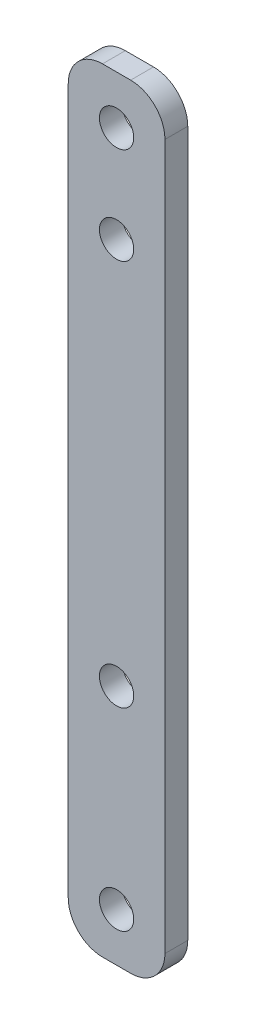
ISO-10303-21;
HEADER;
FILE_DESCRIPTION(('STEP AP214'),'2;1');
FILE_NAME('part.step','',(''),(''),'','','');
FILE_SCHEMA(('AUTOMOTIVE_DESIGN { 1 0 10303 214 1 1 1 1 }'));
ENDSEC;
DATA;
#1=APPLICATION_CONTEXT('core data for automotive mechanical design processes');
#2=APPLICATION_PROTOCOL_DEFINITION('international standard','automotive_design',2000,#1);
#3=PRODUCT_CONTEXT('',#1,'mechanical');
#4=PRODUCT('Part','Part','',(#3));
#5=PRODUCT_RELATED_PRODUCT_CATEGORY('part','',(#4));
#6=PRODUCT_DEFINITION_FORMATION('','',#4);
#7=PRODUCT_DEFINITION_CONTEXT('part definition',#1,'design');
#8=PRODUCT_DEFINITION('design','',#6,#7);
#9=PRODUCT_DEFINITION_SHAPE('','',#8);
#10=(LENGTH_UNIT() NAMED_UNIT(*) SI_UNIT(.MILLI.,.METRE.));
#11=(NAMED_UNIT(*) PLANE_ANGLE_UNIT() SI_UNIT($,.RADIAN.));
#12=(NAMED_UNIT(*) SI_UNIT($,.STERADIAN.) SOLID_ANGLE_UNIT());
#13=UNCERTAINTY_MEASURE_WITH_UNIT(LENGTH_MEASURE(1.E-05),#10,'distance_accuracy_value','');
#14=(GEOMETRIC_REPRESENTATION_CONTEXT(3) GLOBAL_UNCERTAINTY_ASSIGNED_CONTEXT((#13)) GLOBAL_UNIT_ASSIGNED_CONTEXT((#10,
#11,#12)) REPRESENTATION_CONTEXT('',''));
#15=CARTESIAN_POINT('',(0.,0.,0.));
#16=DIRECTION('',(0.,0.,1.));
#17=DIRECTION('',(1.,0.,0.));
#18=AXIS2_PLACEMENT_3D('',#15,#16,#17);
#19=CARTESIAN_POINT('',(0.,0.,3.));
#20=DIRECTION('',(0.,0.,-1.));
#21=DIRECTION('',(-1.,0.,0.));
#22=AXIS2_PLACEMENT_3D('',#19,#20,#21);
#23=PLANE('',#22);
#24=DIRECTION('',(1.,0.,0.));
#25=VECTOR('',#24,1.);
#26=CARTESIAN_POINT('',(0.,0.,3.));
#27=LINE('',#26,#25);
#28=CARTESIAN_POINT('',(4.5,0.,3.));
#29=VERTEX_POINT('',#28);
#30=CARTESIAN_POINT('',(8.2,0.,3.));
#31=VERTEX_POINT('',#30);
#32=EDGE_CURVE('E183',#29,#31,#27,.T.);
#33=ORIENTED_EDGE('',*,*,#32,.T.);
#34=CARTESIAN_POINT('',(8.2,4.5,3.));
#35=DIRECTION('',(0.,0.,-1.));
#36=DIRECTION('',(-1.,0.,0.));
#37=AXIS2_PLACEMENT_3D('',#34,#35,#36);
#38=CIRCLE('',#37,4.5);
#39=CARTESIAN_POINT('',(12.7,4.5,3.));
#40=VERTEX_POINT('',#39);
#41=EDGE_CURVE('E169',#31,#40,#38,.F.);
#42=ORIENTED_EDGE('',*,*,#41,.T.);
#43=DIRECTION('',(0.,1.,0.));
#44=VECTOR('',#43,1.);
#45=CARTESIAN_POINT('',(12.7,0.,3.));
#46=LINE('',#45,#44);
#47=CARTESIAN_POINT('',(12.7,97.1,3.));
#48=VERTEX_POINT('',#47);
#49=EDGE_CURVE('E126',#40,#48,#46,.T.);
#50=ORIENTED_EDGE('',*,*,#49,.T.);
#51=CARTESIAN_POINT('',(8.2,97.1,3.));
#52=DIRECTION('',(0.,0.,-1.));
#53=DIRECTION('',(-1.,0.,0.));
#54=AXIS2_PLACEMENT_3D('',#51,#52,#53);
#55=CIRCLE('',#54,4.5);
#56=CARTESIAN_POINT('',(8.2,101.6,3.));
#57=VERTEX_POINT('',#56);
#58=EDGE_CURVE('E61',#48,#57,#55,.F.);
#59=ORIENTED_EDGE('',*,*,#58,.T.);
#60=DIRECTION('',(-1.,0.,0.));
#61=VECTOR('',#60,1.);
#62=CARTESIAN_POINT('',(0.,101.6,3.));
#63=LINE('',#62,#61);
#64=CARTESIAN_POINT('',(4.5,101.6,3.));
#65=VERTEX_POINT('',#64);
#66=EDGE_CURVE('E148',#57,#65,#63,.T.);
#67=ORIENTED_EDGE('',*,*,#66,.T.);
#68=CARTESIAN_POINT('',(4.5,97.1,3.));
#69=DIRECTION('',(0.,0.,-1.));
#70=DIRECTION('',(-1.,0.,0.));
#71=AXIS2_PLACEMENT_3D('',#68,#69,#70);
#72=CIRCLE('',#71,4.5);
#73=CARTESIAN_POINT('',(0.,97.1,3.));
#74=VERTEX_POINT('',#73);
#75=EDGE_CURVE('E161',#65,#74,#72,.F.);
#76=ORIENTED_EDGE('',*,*,#75,.T.);
#77=DIRECTION('',(0.,-1.,0.));
#78=VECTOR('',#77,1.);
#79=CARTESIAN_POINT('',(0.,0.,3.));
#80=LINE('',#79,#78);
#81=CARTESIAN_POINT('',(0.,4.5,3.));
#82=VERTEX_POINT('',#81);
#83=EDGE_CURVE('E141',#74,#82,#80,.T.);
#84=ORIENTED_EDGE('',*,*,#83,.T.);
#85=CARTESIAN_POINT('',(4.5,4.5,3.));
#86=DIRECTION('',(0.,0.,-1.));
#87=DIRECTION('',(-1.,0.,0.));
#88=AXIS2_PLACEMENT_3D('',#85,#86,#87);
#89=CIRCLE('',#88,4.5);
#90=EDGE_CURVE('E166',#82,#29,#89,.F.);
#91=ORIENTED_EDGE('',*,*,#90,.T.);
#92=EDGE_LOOP('',(#33,#42,#50,#59,#67,#76,#84,#91));
#93=FACE_BOUND('',#92,.T.);
#94=CARTESIAN_POINT('',(6.35,6.35,3.));
#95=DIRECTION('',(0.,0.,1.));
#96=DIRECTION('',(1.,0.,0.));
#97=AXIS2_PLACEMENT_3D('',#94,#95,#96);
#98=CIRCLE('',#97,2.25);
#99=CARTESIAN_POINT('',(8.6,6.35,3.));
#100=VERTEX_POINT('',#99);
#101=EDGE_CURVE('E197',#100,#100,#98,.T.);
#102=ORIENTED_EDGE('',*,*,#101,.F.);
#103=EDGE_LOOP('',(#102));
#104=FACE_BOUND('',#103,.T.);
#105=CARTESIAN_POINT('',(6.35,31.75,3.));
#106=DIRECTION('',(0.,0.,1.));
#107=DIRECTION('',(1.,0.,0.));
#108=AXIS2_PLACEMENT_3D('',#105,#106,#107);
#109=CIRCLE('',#108,2.25);
#110=CARTESIAN_POINT('',(8.6,31.75,3.));
#111=VERTEX_POINT('',#110);
#112=EDGE_CURVE('E207',#111,#111,#109,.T.);
#113=ORIENTED_EDGE('',*,*,#112,.F.);
#114=EDGE_LOOP('',(#113));
#115=FACE_BOUND('',#114,.T.);
#116=CARTESIAN_POINT('',(6.35,95.25,3.));
#117=DIRECTION('',(0.,0.,1.));
#118=DIRECTION('',(1.,0.,0.));
#119=AXIS2_PLACEMENT_3D('',#116,#117,#118);
#120=CIRCLE('',#119,2.25);
#121=CARTESIAN_POINT('',(8.6,95.25,3.));
#122=VERTEX_POINT('',#121);
#123=EDGE_CURVE('E213',#122,#122,#120,.T.);
#124=ORIENTED_EDGE('',*,*,#123,.F.);
#125=EDGE_LOOP('',(#124));
#126=FACE_BOUND('',#125,.T.);
#127=CARTESIAN_POINT('',(6.35,82.55,3.));
#128=DIRECTION('',(0.,0.,1.));
#129=DIRECTION('',(1.,0.,0.));
#130=AXIS2_PLACEMENT_3D('',#127,#128,#129);
#131=CIRCLE('',#130,2.25);
#132=CARTESIAN_POINT('',(8.6,82.55,3.));
#133=VERTEX_POINT('',#132);
#134=EDGE_CURVE('E221',#133,#133,#131,.T.);
#135=ORIENTED_EDGE('',*,*,#134,.F.);
#136=EDGE_LOOP('',(#135));
#137=FACE_BOUND('',#136,.T.);
#138=ADVANCED_FACE('F39',(#93,#104,#115,#126,#137),#23,.F.);
#139=CARTESIAN_POINT('',(0.,0.,0.));
#140=DIRECTION('',(0.,0.,-1.));
#141=DIRECTION('',(-1.,0.,0.));
#142=AXIS2_PLACEMENT_3D('',#139,#140,#141);
#143=PLANE('',#142);
#144=CARTESIAN_POINT('',(6.35,95.25,0.));
#145=DIRECTION('',(0.,0.,1.));
#146=DIRECTION('',(1.,0.,0.));
#147=AXIS2_PLACEMENT_3D('',#144,#145,#146);
#148=CIRCLE('',#147,2.25);
#149=CARTESIAN_POINT('',(8.6,95.25,0.));
#150=VERTEX_POINT('',#149);
#151=EDGE_CURVE('E217',#150,#150,#148,.T.);
#152=ORIENTED_EDGE('',*,*,#151,.T.);
#153=EDGE_LOOP('',(#152));
#154=FACE_BOUND('',#153,.T.);
#155=CARTESIAN_POINT('',(6.35,6.35,0.));
#156=DIRECTION('',(0.,0.,1.));
#157=DIRECTION('',(1.,0.,0.));
#158=AXIS2_PLACEMENT_3D('',#155,#156,#157);
#159=CIRCLE('',#158,2.25);
#160=CARTESIAN_POINT('',(8.6,6.35,0.));
#161=VERTEX_POINT('',#160);
#162=EDGE_CURVE('E193',#161,#161,#159,.T.);
#163=ORIENTED_EDGE('',*,*,#162,.T.);
#164=EDGE_LOOP('',(#163));
#165=FACE_BOUND('',#164,.T.);
#166=DIRECTION('',(0.,1.,0.));
#167=VECTOR('',#166,1.);
#168=CARTESIAN_POINT('',(12.7,0.,0.));
#169=LINE('',#168,#167);
#170=CARTESIAN_POINT('',(12.7,4.5,0.));
#171=VERTEX_POINT('',#170);
#172=CARTESIAN_POINT('',(12.7,97.1,0.));
#173=VERTEX_POINT('',#172);
#174=EDGE_CURVE('E124',#171,#173,#169,.T.);
#175=ORIENTED_EDGE('',*,*,#174,.F.);
#176=CARTESIAN_POINT('',(8.2,4.5,0.));
#177=DIRECTION('',(0.,0.,-1.));
#178=DIRECTION('',(-1.,0.,0.));
#179=AXIS2_PLACEMENT_3D('',#176,#177,#178);
#180=CIRCLE('',#179,4.5);
#181=CARTESIAN_POINT('',(8.2,0.,0.));
#182=VERTEX_POINT('',#181);
#183=EDGE_CURVE('E106',#171,#182,#180,.T.);
#184=ORIENTED_EDGE('',*,*,#183,.T.);
#185=DIRECTION('',(1.,0.,0.));
#186=VECTOR('',#185,1.);
#187=CARTESIAN_POINT('',(0.,0.,0.));
#188=LINE('',#187,#186);
#189=CARTESIAN_POINT('',(4.5,0.,0.));
#190=VERTEX_POINT('',#189);
#191=EDGE_CURVE('E137',#190,#182,#188,.T.);
#192=ORIENTED_EDGE('',*,*,#191,.F.);
#193=CARTESIAN_POINT('',(4.5,4.5,0.));
#194=DIRECTION('',(0.,0.,-1.));
#195=DIRECTION('',(-1.,0.,0.));
#196=AXIS2_PLACEMENT_3D('',#193,#194,#195);
#197=CIRCLE('',#196,4.5);
#198=CARTESIAN_POINT('',(0.,4.5,0.));
#199=VERTEX_POINT('',#198);
#200=EDGE_CURVE('E118',#190,#199,#197,.T.);
#201=ORIENTED_EDGE('',*,*,#200,.T.);
#202=DIRECTION('',(0.,-1.,0.));
#203=VECTOR('',#202,1.);
#204=CARTESIAN_POINT('',(0.,0.,0.));
#205=LINE('',#204,#203);
#206=CARTESIAN_POINT('',(0.,97.1,0.));
#207=VERTEX_POINT('',#206);
#208=EDGE_CURVE('E143',#207,#199,#205,.T.);
#209=ORIENTED_EDGE('',*,*,#208,.F.);
#210=CARTESIAN_POINT('',(4.5,97.1,0.));
#211=DIRECTION('',(0.,0.,-1.));
#212=DIRECTION('',(-1.,0.,0.));
#213=AXIS2_PLACEMENT_3D('',#210,#211,#212);
#214=CIRCLE('',#213,4.5);
#215=CARTESIAN_POINT('',(4.5,101.6,0.));
#216=VERTEX_POINT('',#215);
#217=EDGE_CURVE('E128',#207,#216,#214,.T.);
#218=ORIENTED_EDGE('',*,*,#217,.T.);
#219=DIRECTION('',(-1.,0.,0.));
#220=VECTOR('',#219,1.);
#221=CARTESIAN_POINT('',(0.,101.6,0.));
#222=LINE('',#221,#220);
#223=CARTESIAN_POINT('',(8.2,101.6,0.));
#224=VERTEX_POINT('',#223);
#225=EDGE_CURVE('E136',#224,#216,#222,.T.);
#226=ORIENTED_EDGE('',*,*,#225,.F.);
#227=CARTESIAN_POINT('',(8.2,97.1,0.));
#228=DIRECTION('',(0.,0.,-1.));
#229=DIRECTION('',(-1.,0.,0.));
#230=AXIS2_PLACEMENT_3D('',#227,#228,#229);
#231=CIRCLE('',#230,4.5);
#232=EDGE_CURVE('E134',#224,#173,#231,.T.);
#233=ORIENTED_EDGE('',*,*,#232,.T.);
#234=EDGE_LOOP('',(#175,#184,#192,#201,#209,#218,#226,#233));
#235=FACE_BOUND('',#234,.T.);
#236=CARTESIAN_POINT('',(6.35,31.75,0.));
#237=DIRECTION('',(0.,0.,1.));
#238=DIRECTION('',(1.,0.,0.));
#239=AXIS2_PLACEMENT_3D('',#236,#237,#238);
#240=CIRCLE('',#239,2.25);
#241=CARTESIAN_POINT('',(8.6,31.75,0.));
#242=VERTEX_POINT('',#241);
#243=EDGE_CURVE('E209',#242,#242,#240,.T.);
#244=ORIENTED_EDGE('',*,*,#243,.T.);
#245=EDGE_LOOP('',(#244));
#246=FACE_BOUND('',#245,.T.);
#247=CARTESIAN_POINT('',(6.35,82.55,0.));
#248=DIRECTION('',(0.,0.,1.));
#249=DIRECTION('',(1.,0.,0.));
#250=AXIS2_PLACEMENT_3D('',#247,#248,#249);
#251=CIRCLE('',#250,2.25);
#252=CARTESIAN_POINT('',(8.6,82.55,0.));
#253=VERTEX_POINT('',#252);
#254=EDGE_CURVE('E225',#253,#253,#251,.T.);
#255=ORIENTED_EDGE('',*,*,#254,.T.);
#256=EDGE_LOOP('',(#255));
#257=FACE_BOUND('',#256,.T.);
#258=ADVANCED_FACE('F131',(#154,#165,#235,#246,#257),#143,.T.);
#259=CARTESIAN_POINT('',(0.,0.,3.));
#260=DIRECTION('',(1.,0.,0.));
#261=DIRECTION('',(0.,0.,-1.));
#262=AXIS2_PLACEMENT_3D('',#259,#260,#261);
#263=PLANE('',#262);
#264=ORIENTED_EDGE('',*,*,#208,.T.);
#265=DIRECTION('',(0.,0.,-1.));
#266=VECTOR('',#265,1.);
#267=CARTESIAN_POINT('',(0.,4.5,3.));
#268=LINE('',#267,#266);
#269=EDGE_CURVE('E176',#199,#82,#268,.F.);
#270=ORIENTED_EDGE('',*,*,#269,.T.);
#271=ORIENTED_EDGE('',*,*,#83,.F.);
#272=DIRECTION('',(0.,0.,-1.));
#273=VECTOR('',#272,1.);
#274=CARTESIAN_POINT('',(0.,97.1,3.));
#275=LINE('',#274,#273);
#276=EDGE_CURVE('E172',#74,#207,#275,.T.);
#277=ORIENTED_EDGE('',*,*,#276,.T.);
#278=EDGE_LOOP('',(#264,#270,#271,#277));
#279=FACE_BOUND('',#278,.T.);
#280=ADVANCED_FACE('F241',(#279),#263,.F.);
#281=CARTESIAN_POINT('',(0.,0.,3.));
#282=DIRECTION('',(0.,1.,0.));
#283=DIRECTION('',(0.,0.,1.));
#284=AXIS2_PLACEMENT_3D('',#281,#282,#283);
#285=PLANE('',#284);
#286=ORIENTED_EDGE('',*,*,#191,.T.);
#287=DIRECTION('',(0.,0.,-1.));
#288=VECTOR('',#287,1.);
#289=CARTESIAN_POINT('',(8.2,0.,3.));
#290=LINE('',#289,#288);
#291=EDGE_CURVE('E111',#182,#31,#290,.F.);
#292=ORIENTED_EDGE('',*,*,#291,.T.);
#293=ORIENTED_EDGE('',*,*,#32,.F.);
#294=DIRECTION('',(0.,0.,-1.));
#295=VECTOR('',#294,1.);
#296=CARTESIAN_POINT('',(4.5,0.,3.));
#297=LINE('',#296,#295);
#298=EDGE_CURVE('E117',#29,#190,#297,.T.);
#299=ORIENTED_EDGE('',*,*,#298,.T.);
#300=EDGE_LOOP('',(#286,#292,#293,#299));
#301=FACE_BOUND('',#300,.T.);
#302=ADVANCED_FACE('F254',(#301),#285,.F.);
#303=CARTESIAN_POINT('',(12.7,0.,3.));
#304=DIRECTION('',(-1.,0.,0.));
#305=DIRECTION('',(0.,0.,1.));
#306=AXIS2_PLACEMENT_3D('',#303,#304,#305);
#307=PLANE('',#306);
#308=ORIENTED_EDGE('',*,*,#49,.F.);
#309=DIRECTION('',(0.,0.,-1.));
#310=VECTOR('',#309,1.);
#311=CARTESIAN_POINT('',(12.7,4.5,3.));
#312=LINE('',#311,#310);
#313=EDGE_CURVE('E110',#40,#171,#312,.T.);
#314=ORIENTED_EDGE('',*,*,#313,.T.);
#315=ORIENTED_EDGE('',*,*,#174,.T.);
#316=DIRECTION('',(0.,0.,-1.));
#317=VECTOR('',#316,1.);
#318=CARTESIAN_POINT('',(12.7,97.1,3.));
#319=LINE('',#318,#317);
#320=EDGE_CURVE('E129',#173,#48,#319,.F.);
#321=ORIENTED_EDGE('',*,*,#320,.T.);
#322=EDGE_LOOP('',(#308,#314,#315,#321));
#323=FACE_BOUND('',#322,.T.);
#324=ADVANCED_FACE('F123',(#323),#307,.F.);
#325=CARTESIAN_POINT('',(0.,101.6,3.));
#326=DIRECTION('',(0.,-1.,0.));
#327=DIRECTION('',(0.,0.,-1.));
#328=AXIS2_PLACEMENT_3D('',#325,#326,#327);
#329=PLANE('',#328);
#330=ORIENTED_EDGE('',*,*,#66,.F.);
#331=DIRECTION('',(0.,0.,-1.));
#332=VECTOR('',#331,1.);
#333=CARTESIAN_POINT('',(8.2,101.6,3.));
#334=LINE('',#333,#332);
#335=EDGE_CURVE('E11',#57,#224,#334,.T.);
#336=ORIENTED_EDGE('',*,*,#335,.T.);
#337=ORIENTED_EDGE('',*,*,#225,.T.);
#338=DIRECTION('',(0.,0.,-1.));
#339=VECTOR('',#338,1.);
#340=CARTESIAN_POINT('',(4.5,101.6,3.));
#341=LINE('',#340,#339);
#342=EDGE_CURVE('E48',#216,#65,#341,.F.);
#343=ORIENTED_EDGE('',*,*,#342,.T.);
#344=EDGE_LOOP('',(#330,#336,#337,#343));
#345=FACE_BOUND('',#344,.T.);
#346=ADVANCED_FACE('F249',(#345),#329,.F.);
#347=CARTESIAN_POINT('',(6.35,6.35,3.));
#348=DIRECTION('',(0.,0.,-1.));
#349=DIRECTION('',(-1.,0.,0.));
#350=AXIS2_PLACEMENT_3D('',#347,#348,#349);
#351=CYLINDRICAL_SURFACE('',#350,2.25);
#352=ORIENTED_EDGE('',*,*,#101,.T.);
#353=EDGE_LOOP('',(#352));
#354=FACE_BOUND('',#353,.T.);
#355=ORIENTED_EDGE('',*,*,#162,.F.);
#356=EDGE_LOOP('',(#355));
#357=FACE_BOUND('',#356,.T.);
#358=ADVANCED_FACE('F246',(#354,#357),#351,.F.);
#359=CARTESIAN_POINT('',(6.35,31.75,3.));
#360=DIRECTION('',(0.,0.,-1.));
#361=DIRECTION('',(-1.,0.,0.));
#362=AXIS2_PLACEMENT_3D('',#359,#360,#361);
#363=CYLINDRICAL_SURFACE('',#362,2.25);
#364=ORIENTED_EDGE('',*,*,#112,.T.);
#365=EDGE_LOOP('',(#364));
#366=FACE_BOUND('',#365,.T.);
#367=ORIENTED_EDGE('',*,*,#243,.F.);
#368=EDGE_LOOP('',(#367));
#369=FACE_BOUND('',#368,.T.);
#370=ADVANCED_FACE('F349',(#366,#369),#363,.F.);
#371=CARTESIAN_POINT('',(6.35,95.25,3.));
#372=DIRECTION('',(0.,0.,-1.));
#373=DIRECTION('',(-1.,0.,0.));
#374=AXIS2_PLACEMENT_3D('',#371,#372,#373);
#375=CYLINDRICAL_SURFACE('',#374,2.25);
#376=ORIENTED_EDGE('',*,*,#123,.T.);
#377=EDGE_LOOP('',(#376));
#378=FACE_BOUND('',#377,.T.);
#379=ORIENTED_EDGE('',*,*,#151,.F.);
#380=EDGE_LOOP('',(#379));
#381=FACE_BOUND('',#380,.T.);
#382=ADVANCED_FACE('F340',(#378,#381),#375,.F.);
#383=CARTESIAN_POINT('',(6.35,82.55,3.));
#384=DIRECTION('',(0.,0.,-1.));
#385=DIRECTION('',(-1.,0.,0.));
#386=AXIS2_PLACEMENT_3D('',#383,#384,#385);
#387=CYLINDRICAL_SURFACE('',#386,2.25);
#388=ORIENTED_EDGE('',*,*,#134,.T.);
#389=EDGE_LOOP('',(#388));
#390=FACE_BOUND('',#389,.T.);
#391=ORIENTED_EDGE('',*,*,#254,.F.);
#392=EDGE_LOOP('',(#391));
#393=FACE_BOUND('',#392,.T.);
#394=ADVANCED_FACE('F233',(#390,#393),#387,.F.);
#395=CARTESIAN_POINT('',(8.2,4.5,3.));
#396=DIRECTION('',(0.,0.,-1.));
#397=DIRECTION('',(-1.,0.,0.));
#398=AXIS2_PLACEMENT_3D('',#395,#396,#397);
#399=CYLINDRICAL_SURFACE('',#398,4.5);
#400=ORIENTED_EDGE('',*,*,#41,.F.);
#401=ORIENTED_EDGE('',*,*,#291,.F.);
#402=ORIENTED_EDGE('',*,*,#183,.F.);
#403=ORIENTED_EDGE('',*,*,#313,.F.);
#404=EDGE_LOOP('',(#400,#401,#402,#403));
#405=FACE_BOUND('',#404,.T.);
#406=ADVANCED_FACE('F109',(#405),#399,.T.);
#407=CARTESIAN_POINT('',(4.5,4.5,3.));
#408=DIRECTION('',(0.,0.,-1.));
#409=DIRECTION('',(-1.,0.,0.));
#410=AXIS2_PLACEMENT_3D('',#407,#408,#409);
#411=CYLINDRICAL_SURFACE('',#410,4.5);
#412=ORIENTED_EDGE('',*,*,#90,.F.);
#413=ORIENTED_EDGE('',*,*,#269,.F.);
#414=ORIENTED_EDGE('',*,*,#200,.F.);
#415=ORIENTED_EDGE('',*,*,#298,.F.);
#416=EDGE_LOOP('',(#412,#413,#414,#415));
#417=FACE_BOUND('',#416,.T.);
#418=ADVANCED_FACE('F262',(#417),#411,.T.);
#419=CARTESIAN_POINT('',(8.2,97.1,3.));
#420=DIRECTION('',(0.,0.,-1.));
#421=DIRECTION('',(-1.,0.,0.));
#422=AXIS2_PLACEMENT_3D('',#419,#420,#421);
#423=CYLINDRICAL_SURFACE('',#422,4.5);
#424=ORIENTED_EDGE('',*,*,#58,.F.);
#425=ORIENTED_EDGE('',*,*,#320,.F.);
#426=ORIENTED_EDGE('',*,*,#232,.F.);
#427=ORIENTED_EDGE('',*,*,#335,.F.);
#428=EDGE_LOOP('',(#424,#425,#426,#427));
#429=FACE_BOUND('',#428,.T.);
#430=ADVANCED_FACE('F264',(#429),#423,.T.);
#431=CARTESIAN_POINT('',(4.5,97.1,3.));
#432=DIRECTION('',(0.,0.,-1.));
#433=DIRECTION('',(-1.,0.,0.));
#434=AXIS2_PLACEMENT_3D('',#431,#432,#433);
#435=CYLINDRICAL_SURFACE('',#434,4.5);
#436=ORIENTED_EDGE('',*,*,#75,.F.);
#437=ORIENTED_EDGE('',*,*,#342,.F.);
#438=ORIENTED_EDGE('',*,*,#217,.F.);
#439=ORIENTED_EDGE('',*,*,#276,.F.);
#440=EDGE_LOOP('',(#436,#437,#438,#439));
#441=FACE_BOUND('',#440,.T.);
#442=ADVANCED_FACE('F41',(#441),#435,.T.);
#443=CLOSED_SHELL('',(#138,#258,#280,#302,#324,#346,#358,#370,#382,#394,#406,#418,#430,#442));
#444=MANIFOLD_SOLID_BREP('B2',#443);
#445=ADVANCED_BREP_SHAPE_REPRESENTATION('',(#18,#444),#14);
#446=SHAPE_DEFINITION_REPRESENTATION(#9,#445);
ENDSEC;
END-ISO-10303-21;
